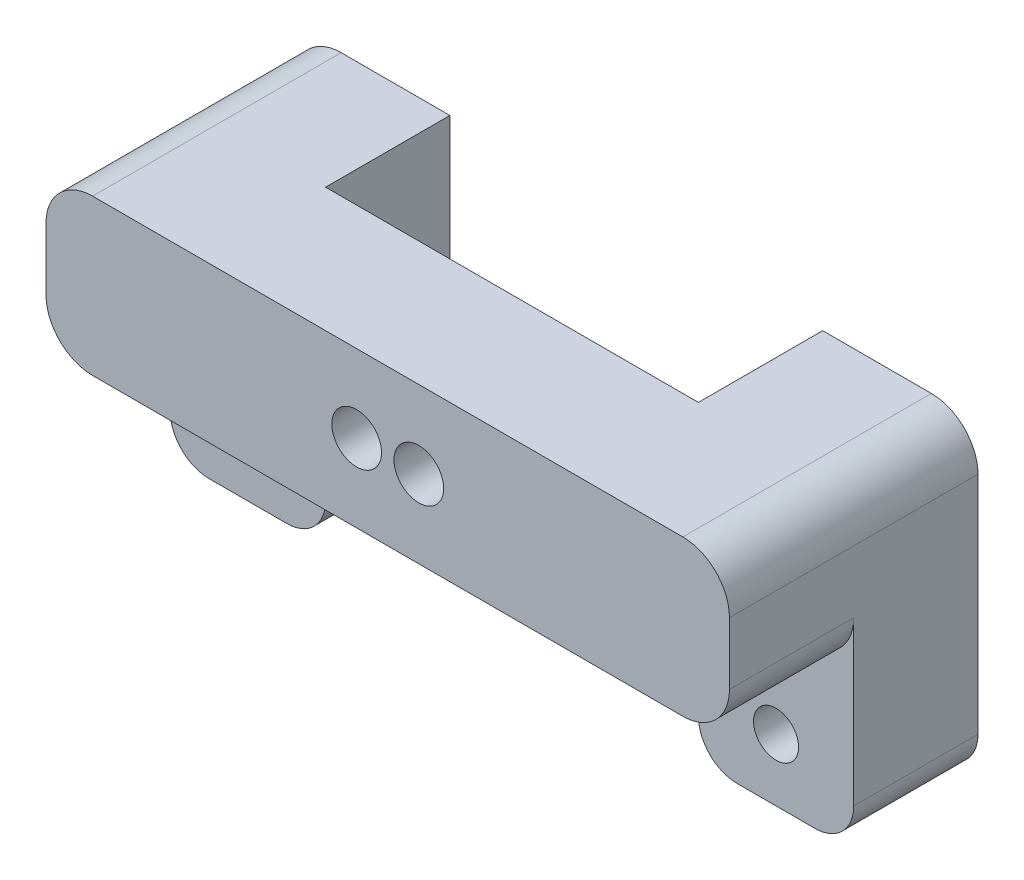
ISO-10303-21;
HEADER;
FILE_DESCRIPTION(('STEP AP214'),'2;1');
FILE_NAME('part.step','',(''),(''),'','','');
FILE_SCHEMA(('AUTOMOTIVE_DESIGN { 1 0 10303 214 1 1 1 1 }'));
ENDSEC;
DATA;
#1=APPLICATION_CONTEXT('core data for automotive mechanical design processes');
#2=APPLICATION_PROTOCOL_DEFINITION('international standard','automotive_design',2000,#1);
#3=PRODUCT_CONTEXT('',#1,'mechanical');
#4=PRODUCT('Part','Part','',(#3));
#5=PRODUCT_RELATED_PRODUCT_CATEGORY('part','',(#4));
#6=PRODUCT_DEFINITION_FORMATION('','',#4);
#7=PRODUCT_DEFINITION_CONTEXT('part definition',#1,'design');
#8=PRODUCT_DEFINITION('design','',#6,#7);
#9=PRODUCT_DEFINITION_SHAPE('','',#8);
#10=(LENGTH_UNIT() NAMED_UNIT(*) SI_UNIT(.MILLI.,.METRE.));
#11=(NAMED_UNIT(*) PLANE_ANGLE_UNIT() SI_UNIT($,.RADIAN.));
#12=(NAMED_UNIT(*) SI_UNIT($,.STERADIAN.) SOLID_ANGLE_UNIT());
#13=UNCERTAINTY_MEASURE_WITH_UNIT(LENGTH_MEASURE(1.E-05),#10,'distance_accuracy_value','');
#14=(GEOMETRIC_REPRESENTATION_CONTEXT(3) GLOBAL_UNCERTAINTY_ASSIGNED_CONTEXT((#13)) GLOBAL_UNIT_ASSIGNED_CONTEXT((#10,
#11,#12)) REPRESENTATION_CONTEXT('',''));
#15=CARTESIAN_POINT('',(0.,0.,0.));
#16=DIRECTION('',(0.,0.,1.));
#17=DIRECTION('',(1.,0.,0.));
#18=AXIS2_PLACEMENT_3D('',#15,#16,#17);
#19=CARTESIAN_POINT('',(0.,-10.,8.));
#20=DIRECTION('',(0.,1.,0.));
#21=DIRECTION('',(0.,0.,1.));
#22=AXIS2_PLACEMENT_3D('',#19,#20,#21);
#23=PLANE('',#22);
#24=DIRECTION('',(1.,0.,0.));
#25=VECTOR('',#24,1.);
#26=CARTESIAN_POINT('',(0.,-10.,8.));
#27=LINE('',#26,#25);
#28=CARTESIAN_POINT('',(3.,-10.,8.));
#29=VERTEX_POINT('',#28);
#30=CARTESIAN_POINT('',(41.,-10.,8.));
#31=VERTEX_POINT('',#30);
#32=EDGE_CURVE('E301',#29,#31,#27,.T.);
#33=ORIENTED_EDGE('',*,*,#32,.F.);
#34=DIRECTION('',(0.,0.,-1.));
#35=VECTOR('',#34,1.);
#36=CARTESIAN_POINT('',(3.,-10.,8.));
#37=LINE('',#36,#35);
#38=CARTESIAN_POINT('',(3.,-10.,0.));
#39=VERTEX_POINT('',#38);
#40=EDGE_CURVE('E254',#29,#39,#37,.T.);
#41=ORIENTED_EDGE('',*,*,#40,.T.);
#42=DIRECTION('',(-1.,0.,0.));
#43=VECTOR('',#42,1.);
#44=CARTESIAN_POINT('',(10.,-10.,0.));
#45=LINE('',#44,#43);
#46=CARTESIAN_POINT('',(10.,-10.,0.));
#47=VERTEX_POINT('',#46);
#48=EDGE_CURVE('E204',#47,#39,#45,.T.);
#49=ORIENTED_EDGE('',*,*,#48,.F.);
#50=DIRECTION('',(1.,0.,0.));
#51=VECTOR('',#50,1.);
#52=CARTESIAN_POINT('',(0.,-10.,0.));
#53=LINE('',#52,#51);
#54=CARTESIAN_POINT('',(34.,-10.,0.));
#55=VERTEX_POINT('',#54);
#56=EDGE_CURVE('E194',#47,#55,#53,.T.);
#57=ORIENTED_EDGE('',*,*,#56,.T.);
#58=DIRECTION('',(-1.,0.,0.));
#59=VECTOR('',#58,1.);
#60=CARTESIAN_POINT('',(34.,-10.,0.));
#61=LINE('',#60,#59);
#62=CARTESIAN_POINT('',(41.,-10.,0.));
#63=VERTEX_POINT('',#62);
#64=EDGE_CURVE('E164',#63,#55,#61,.T.);
#65=ORIENTED_EDGE('',*,*,#64,.F.);
#66=DIRECTION('',(0.,0.,-1.));
#67=VECTOR('',#66,1.);
#68=CARTESIAN_POINT('',(41.,-10.,8.));
#69=LINE('',#68,#67);
#70=EDGE_CURVE('E252',#63,#31,#69,.F.);
#71=ORIENTED_EDGE('',*,*,#70,.T.);
#72=EDGE_LOOP('',(#33,#41,#49,#57,#65,#71));
#73=FACE_BOUND('',#72,.T.);
#74=ADVANCED_FACE('F33',(#73),#23,.F.);
#75=CARTESIAN_POINT('',(0.,0.,0.));
#76=DIRECTION('',(0.,0.,1.));
#77=DIRECTION('',(1.,0.,0.));
#78=AXIS2_PLACEMENT_3D('',#75,#76,#77);
#79=PLANE('',#78);
#80=CARTESIAN_POINT('',(24.,-5.,0.));
#81=DIRECTION('',(0.,0.,1.));
#82=DIRECTION('',(1.,0.,0.));
#83=AXIS2_PLACEMENT_3D('',#80,#81,#82);
#84=CIRCLE('',#83,1.6);
#85=CARTESIAN_POINT('',(25.6,-5.,0.));
#86=VERTEX_POINT('',#85);
#87=EDGE_CURVE('E353',#86,#86,#84,.T.);
#88=ORIENTED_EDGE('',*,*,#87,.T.);
#89=EDGE_LOOP('',(#88));
#90=FACE_BOUND('',#89,.T.);
#91=CARTESIAN_POINT('',(20.,-5.,0.));
#92=DIRECTION('',(0.,0.,1.));
#93=DIRECTION('',(1.,0.,0.));
#94=AXIS2_PLACEMENT_3D('',#91,#92,#93);
#95=CIRCLE('',#94,1.6);
#96=CARTESIAN_POINT('',(21.6,-5.,0.));
#97=VERTEX_POINT('',#96);
#98=EDGE_CURVE('E198',#97,#97,#95,.T.);
#99=ORIENTED_EDGE('',*,*,#98,.T.);
#100=EDGE_LOOP('',(#99));
#101=FACE_BOUND('',#100,.T.);
#102=DIRECTION('',(0.,1.,0.));
#103=VECTOR('',#102,1.);
#104=CARTESIAN_POINT('',(34.,-10.,0.));
#105=LINE('',#104,#103);
#106=CARTESIAN_POINT('',(34.,0.,0.));
#107=VERTEX_POINT('',#106);
#108=EDGE_CURVE('E183',#55,#107,#105,.T.);
#109=ORIENTED_EDGE('',*,*,#108,.F.);
#110=ORIENTED_EDGE('',*,*,#56,.F.);
#111=DIRECTION('',(0.,-1.,0.));
#112=VECTOR('',#111,1.);
#113=CARTESIAN_POINT('',(10.,-10.,0.));
#114=LINE('',#113,#112);
#115=CARTESIAN_POINT('',(10.,0.,0.));
#116=VERTEX_POINT('',#115);
#117=EDGE_CURVE('E319',#116,#47,#114,.T.);
#118=ORIENTED_EDGE('',*,*,#117,.F.);
#119=DIRECTION('',(-1.,0.,0.));
#120=VECTOR('',#119,1.);
#121=CARTESIAN_POINT('',(0.,0.,0.));
#122=LINE('',#121,#120);
#123=EDGE_CURVE('E196',#107,#116,#122,.T.);
#124=ORIENTED_EDGE('',*,*,#123,.F.);
#125=EDGE_LOOP('',(#109,#110,#118,#124));
#126=FACE_BOUND('',#125,.T.);
#127=ADVANCED_FACE('F192',(#90,#101,#126),#79,.F.);
#128=CARTESIAN_POINT('',(0.,0.,8.));
#129=DIRECTION('',(1.,0.,0.));
#130=DIRECTION('',(0.,0.,-1.));
#131=AXIS2_PLACEMENT_3D('',#128,#129,#130);
#132=PLANE('',#131);
#133=DIRECTION('',(0.,1.,0.));
#134=VECTOR('',#133,1.);
#135=CARTESIAN_POINT('',(0.,-20.,0.));
#136=LINE('',#135,#134);
#137=CARTESIAN_POINT('',(0.,-17.5,0.));
#138=VERTEX_POINT('',#137);
#139=CARTESIAN_POINT('',(0.,-7.,0.));
#140=VERTEX_POINT('',#139);
#141=EDGE_CURVE('E285',#138,#140,#136,.T.);
#142=ORIENTED_EDGE('',*,*,#141,.T.);
#143=DIRECTION('',(0.,0.,-1.));
#144=VECTOR('',#143,1.);
#145=CARTESIAN_POINT('',(0.,-7.,8.));
#146=LINE('',#145,#144);
#147=CARTESIAN_POINT('',(0.,-7.,8.));
#148=VERTEX_POINT('',#147);
#149=EDGE_CURVE('E259',#140,#148,#146,.F.);
#150=ORIENTED_EDGE('',*,*,#149,.T.);
#151=DIRECTION('',(0.,-1.,0.));
#152=VECTOR('',#151,1.);
#153=CARTESIAN_POINT('',(0.,0.,8.));
#154=LINE('',#153,#152);
#155=CARTESIAN_POINT('',(0.,-3.,8.));
#156=VERTEX_POINT('',#155);
#157=EDGE_CURVE('E207',#156,#148,#154,.T.);
#158=ORIENTED_EDGE('',*,*,#157,.F.);
#159=DIRECTION('',(0.,0.,-1.));
#160=VECTOR('',#159,1.);
#161=CARTESIAN_POINT('',(0.,-3.,8.));
#162=LINE('',#161,#160);
#163=CARTESIAN_POINT('',(0.,-3.,-8.));
#164=VERTEX_POINT('',#163);
#165=EDGE_CURVE('E256',#156,#164,#162,.T.);
#166=ORIENTED_EDGE('',*,*,#165,.T.);
#167=DIRECTION('',(0.,1.,0.));
#168=VECTOR('',#167,1.);
#169=CARTESIAN_POINT('',(0.,-10.,-8.));
#170=LINE('',#169,#168);
#171=CARTESIAN_POINT('',(0.,-17.5,-8.));
#172=VERTEX_POINT('',#171);
#173=EDGE_CURVE('E314',#172,#164,#170,.T.);
#174=ORIENTED_EDGE('',*,*,#173,.F.);
#175=DIRECTION('',(0.,0.,-1.));
#176=VECTOR('',#175,1.);
#177=CARTESIAN_POINT('',(0.,-17.5,8.));
#178=LINE('',#177,#176);
#179=EDGE_CURVE('E250',#172,#138,#178,.F.);
#180=ORIENTED_EDGE('',*,*,#179,.T.);
#181=EDGE_LOOP('',(#142,#150,#158,#166,#174,#180));
#182=FACE_BOUND('',#181,.T.);
#183=ADVANCED_FACE('F294',(#182),#132,.F.);
#184=CARTESIAN_POINT('',(44.,0.,8.));
#185=DIRECTION('',(-1.,0.,0.));
#186=DIRECTION('',(0.,0.,1.));
#187=AXIS2_PLACEMENT_3D('',#184,#185,#186);
#188=PLANE('',#187);
#189=DIRECTION('',(0.,1.,0.));
#190=VECTOR('',#189,1.);
#191=CARTESIAN_POINT('',(44.,0.,8.));
#192=LINE('',#191,#190);
#193=CARTESIAN_POINT('',(44.,-7.,8.));
#194=VERTEX_POINT('',#193);
#195=CARTESIAN_POINT('',(44.,-3.,8.));
#196=VERTEX_POINT('',#195);
#197=EDGE_CURVE('E303',#194,#196,#192,.T.);
#198=ORIENTED_EDGE('',*,*,#197,.F.);
#199=DIRECTION('',(0.,0.,-1.));
#200=VECTOR('',#199,1.);
#201=CARTESIAN_POINT('',(44.,-7.,8.));
#202=LINE('',#201,#200);
#203=CARTESIAN_POINT('',(44.,-7.,0.));
#204=VERTEX_POINT('',#203);
#205=EDGE_CURVE('E271',#194,#204,#202,.T.);
#206=ORIENTED_EDGE('',*,*,#205,.T.);
#207=DIRECTION('',(0.,1.,0.));
#208=VECTOR('',#207,1.);
#209=CARTESIAN_POINT('',(44.,-20.,0.));
#210=LINE('',#209,#208);
#211=CARTESIAN_POINT('',(44.,-17.5,0.));
#212=VERTEX_POINT('',#211);
#213=EDGE_CURVE('E187',#212,#204,#210,.T.);
#214=ORIENTED_EDGE('',*,*,#213,.F.);
#215=DIRECTION('',(0.,0.,1.));
#216=VECTOR('',#215,1.);
#217=CARTESIAN_POINT('',(44.,-17.5,-8.));
#218=LINE('',#217,#216);
#219=CARTESIAN_POINT('',(44.,-17.5,-8.));
#220=VERTEX_POINT('',#219);
#221=EDGE_CURVE('E226',#212,#220,#218,.F.);
#222=ORIENTED_EDGE('',*,*,#221,.T.);
#223=DIRECTION('',(0.,-1.,0.));
#224=VECTOR('',#223,1.);
#225=CARTESIAN_POINT('',(44.,-10.,-8.));
#226=LINE('',#225,#224);
#227=CARTESIAN_POINT('',(44.,-3.,-8.));
#228=VERTEX_POINT('',#227);
#229=EDGE_CURVE('E197',#228,#220,#226,.T.);
#230=ORIENTED_EDGE('',*,*,#229,.F.);
#231=DIRECTION('',(0.,0.,-1.));
#232=VECTOR('',#231,1.);
#233=CARTESIAN_POINT('',(44.,-3.,8.));
#234=LINE('',#233,#232);
#235=EDGE_CURVE('E269',#228,#196,#234,.F.);
#236=ORIENTED_EDGE('',*,*,#235,.T.);
#237=EDGE_LOOP('',(#198,#206,#214,#222,#230,#236));
#238=FACE_BOUND('',#237,.T.);
#239=ADVANCED_FACE('F420',(#238),#188,.F.);
#240=CARTESIAN_POINT('',(0.,0.,8.));
#241=DIRECTION('',(0.,-1.,0.));
#242=DIRECTION('',(0.,0.,-1.));
#243=AXIS2_PLACEMENT_3D('',#240,#241,#242);
#244=PLANE('',#243);
#245=DIRECTION('',(-1.,0.,0.));
#246=VECTOR('',#245,1.);
#247=CARTESIAN_POINT('',(0.,0.,8.));
#248=LINE('',#247,#246);
#249=CARTESIAN_POINT('',(41.,0.,8.));
#250=VERTEX_POINT('',#249);
#251=CARTESIAN_POINT('',(3.,0.,8.));
#252=VERTEX_POINT('',#251);
#253=EDGE_CURVE('E213',#250,#252,#248,.T.);
#254=ORIENTED_EDGE('',*,*,#253,.F.);
#255=DIRECTION('',(0.,0.,-1.));
#256=VECTOR('',#255,1.);
#257=CARTESIAN_POINT('',(41.,0.,8.));
#258=LINE('',#257,#256);
#259=CARTESIAN_POINT('',(41.,0.,-8.));
#260=VERTEX_POINT('',#259);
#261=EDGE_CURVE('E276',#250,#260,#258,.T.);
#262=ORIENTED_EDGE('',*,*,#261,.T.);
#263=DIRECTION('',(1.,0.,0.));
#264=VECTOR('',#263,1.);
#265=CARTESIAN_POINT('',(44.,0.,-8.));
#266=LINE('',#265,#264);
#267=CARTESIAN_POINT('',(34.,0.,-8.));
#268=VERTEX_POINT('',#267);
#269=EDGE_CURVE('E364',#268,#260,#266,.T.);
#270=ORIENTED_EDGE('',*,*,#269,.F.);
#271=DIRECTION('',(0.,0.,1.));
#272=VECTOR('',#271,1.);
#273=CARTESIAN_POINT('',(34.,0.,-8.));
#274=LINE('',#273,#272);
#275=EDGE_CURVE('E322',#268,#107,#274,.T.);
#276=ORIENTED_EDGE('',*,*,#275,.T.);
#277=ORIENTED_EDGE('',*,*,#123,.T.);
#278=DIRECTION('',(0.,0.,1.));
#279=VECTOR('',#278,1.);
#280=CARTESIAN_POINT('',(10.,0.,-8.));
#281=LINE('',#280,#279);
#282=CARTESIAN_POINT('',(10.,0.,-8.));
#283=VERTEX_POINT('',#282);
#284=EDGE_CURVE('E205',#283,#116,#281,.T.);
#285=ORIENTED_EDGE('',*,*,#284,.F.);
#286=DIRECTION('',(1.,0.,0.));
#287=VECTOR('',#286,1.);
#288=CARTESIAN_POINT('',(0.,0.,-8.));
#289=LINE('',#288,#287);
#290=CARTESIAN_POINT('',(3.,0.,-8.));
#291=VERTEX_POINT('',#290);
#292=EDGE_CURVE('E318',#291,#283,#289,.T.);
#293=ORIENTED_EDGE('',*,*,#292,.F.);
#294=DIRECTION('',(0.,0.,-1.));
#295=VECTOR('',#294,1.);
#296=CARTESIAN_POINT('',(3.,0.,8.));
#297=LINE('',#296,#295);
#298=EDGE_CURVE('E274',#291,#252,#297,.F.);
#299=ORIENTED_EDGE('',*,*,#298,.T.);
#300=EDGE_LOOP('',(#254,#262,#270,#276,#277,#285,#293,#299));
#301=FACE_BOUND('',#300,.T.);
#302=ADVANCED_FACE('F368',(#301),#244,.F.);
#303=CARTESIAN_POINT('',(0.,0.,8.));
#304=DIRECTION('',(0.,0.,1.));
#305=DIRECTION('',(1.,0.,0.));
#306=AXIS2_PLACEMENT_3D('',#303,#304,#305);
#307=PLANE('',#306);
#308=CARTESIAN_POINT('',(24.,-5.,8.));
#309=DIRECTION('',(0.,0.,1.));
#310=DIRECTION('',(1.,0.,0.));
#311=AXIS2_PLACEMENT_3D('',#308,#309,#310);
#312=CIRCLE('',#311,1.6);
#313=CARTESIAN_POINT('',(25.6,-5.,8.));
#314=VERTEX_POINT('',#313);
#315=EDGE_CURVE('E350',#314,#314,#312,.T.);
#316=ORIENTED_EDGE('',*,*,#315,.F.);
#317=EDGE_LOOP('',(#316));
#318=FACE_BOUND('',#317,.T.);
#319=CARTESIAN_POINT('',(20.,-5.,8.));
#320=DIRECTION('',(0.,0.,1.));
#321=DIRECTION('',(1.,0.,0.));
#322=AXIS2_PLACEMENT_3D('',#319,#320,#321);
#323=CIRCLE('',#322,1.6);
#324=CARTESIAN_POINT('',(21.6,-5.,8.));
#325=VERTEX_POINT('',#324);
#326=EDGE_CURVE('E356',#325,#325,#323,.T.);
#327=ORIENTED_EDGE('',*,*,#326,.F.);
#328=EDGE_LOOP('',(#327));
#329=FACE_BOUND('',#328,.T.);
#330=ORIENTED_EDGE('',*,*,#157,.T.);
#331=CARTESIAN_POINT('',(3.,-7.,8.));
#332=DIRECTION('',(0.,0.,1.));
#333=DIRECTION('',(1.,0.,0.));
#334=AXIS2_PLACEMENT_3D('',#331,#332,#333);
#335=CIRCLE('',#334,3.);
#336=EDGE_CURVE('E267',#148,#29,#335,.T.);
#337=ORIENTED_EDGE('',*,*,#336,.T.);
#338=ORIENTED_EDGE('',*,*,#32,.T.);
#339=CARTESIAN_POINT('',(41.,-7.,8.));
#340=DIRECTION('',(0.,0.,1.));
#341=DIRECTION('',(1.,0.,0.));
#342=AXIS2_PLACEMENT_3D('',#339,#340,#341);
#343=CIRCLE('',#342,3.);
#344=EDGE_CURVE('E265',#31,#194,#343,.T.);
#345=ORIENTED_EDGE('',*,*,#344,.T.);
#346=ORIENTED_EDGE('',*,*,#197,.T.);
#347=CARTESIAN_POINT('',(41.,-3.,8.));
#348=DIRECTION('',(0.,0.,1.));
#349=DIRECTION('',(1.,0.,0.));
#350=AXIS2_PLACEMENT_3D('',#347,#348,#349);
#351=CIRCLE('',#350,3.);
#352=EDGE_CURVE('E263',#196,#250,#351,.T.);
#353=ORIENTED_EDGE('',*,*,#352,.T.);
#354=ORIENTED_EDGE('',*,*,#253,.T.);
#355=CARTESIAN_POINT('',(3.,-3.,8.));
#356=DIRECTION('',(0.,0.,1.));
#357=DIRECTION('',(1.,0.,0.));
#358=AXIS2_PLACEMENT_3D('',#355,#356,#357);
#359=CIRCLE('',#358,3.);
#360=EDGE_CURVE('E261',#252,#156,#359,.T.);
#361=ORIENTED_EDGE('',*,*,#360,.T.);
#362=EDGE_LOOP('',(#330,#337,#338,#345,#346,#353,#354,#361));
#363=FACE_BOUND('',#362,.T.);
#364=ADVANCED_FACE('F297',(#318,#329,#363),#307,.T.);
#365=CARTESIAN_POINT('',(10.,-10.,-8.));
#366=DIRECTION('',(-1.,0.,0.));
#367=DIRECTION('',(0.,-1.,0.));
#368=AXIS2_PLACEMENT_3D('',#365,#366,#367);
#369=PLANE('',#368);
#370=DIRECTION('',(0.,1.,0.));
#371=VECTOR('',#370,1.);
#372=CARTESIAN_POINT('',(10.,-20.,0.));
#373=LINE('',#372,#371);
#374=CARTESIAN_POINT('',(10.,-17.5,0.));
#375=VERTEX_POINT('',#374);
#376=EDGE_CURVE('E348',#375,#47,#373,.T.);
#377=ORIENTED_EDGE('',*,*,#376,.F.);
#378=DIRECTION('',(0.,0.,1.));
#379=VECTOR('',#378,1.);
#380=CARTESIAN_POINT('',(10.,-17.5,-8.));
#381=LINE('',#380,#379);
#382=CARTESIAN_POINT('',(10.,-17.5,-8.));
#383=VERTEX_POINT('',#382);
#384=EDGE_CURVE('E244',#375,#383,#381,.F.);
#385=ORIENTED_EDGE('',*,*,#384,.T.);
#386=DIRECTION('',(0.,-1.,0.));
#387=VECTOR('',#386,1.);
#388=CARTESIAN_POINT('',(10.,-10.,-8.));
#389=LINE('',#388,#387);
#390=EDGE_CURVE('E210',#283,#383,#389,.T.);
#391=ORIENTED_EDGE('',*,*,#390,.F.);
#392=ORIENTED_EDGE('',*,*,#284,.T.);
#393=ORIENTED_EDGE('',*,*,#117,.T.);
#394=EDGE_LOOP('',(#377,#385,#391,#392,#393));
#395=FACE_BOUND('',#394,.T.);
#396=ADVANCED_FACE('F467',(#395),#369,.F.);
#397=CARTESIAN_POINT('',(0.,0.,-8.));
#398=DIRECTION('',(0.,0.,-1.));
#399=DIRECTION('',(-1.,0.,0.));
#400=AXIS2_PLACEMENT_3D('',#397,#398,#399);
#401=PLANE('',#400);
#402=CARTESIAN_POINT('',(5.,-16.,-8.));
#403=DIRECTION('',(0.,0.,1.));
#404=DIRECTION('',(1.,0.,0.));
#405=AXIS2_PLACEMENT_3D('',#402,#403,#404);
#406=CIRCLE('',#405,1.45);
#407=CARTESIAN_POINT('',(6.45,-16.,-8.));
#408=VERTEX_POINT('',#407);
#409=EDGE_CURVE('E175',#408,#408,#406,.T.);
#410=ORIENTED_EDGE('',*,*,#409,.T.);
#411=EDGE_LOOP('',(#410));
#412=FACE_BOUND('',#411,.T.);
#413=ORIENTED_EDGE('',*,*,#173,.T.);
#414=CARTESIAN_POINT('',(3.,-3.,-8.));
#415=DIRECTION('',(0.,0.,-1.));
#416=DIRECTION('',(-1.,0.,0.));
#417=AXIS2_PLACEMENT_3D('',#414,#415,#416);
#418=CIRCLE('',#417,3.);
#419=EDGE_CURVE('E48',#164,#291,#418,.T.);
#420=ORIENTED_EDGE('',*,*,#419,.T.);
#421=ORIENTED_EDGE('',*,*,#292,.T.);
#422=ORIENTED_EDGE('',*,*,#390,.T.);
#423=CARTESIAN_POINT('',(7.5,-17.5,-8.));
#424=DIRECTION('',(0.,0.,-1.));
#425=DIRECTION('',(-1.,0.,0.));
#426=AXIS2_PLACEMENT_3D('',#423,#424,#425);
#427=CIRCLE('',#426,2.5);
#428=CARTESIAN_POINT('',(7.5,-20.,-8.));
#429=VERTEX_POINT('',#428);
#430=EDGE_CURVE('E248',#383,#429,#427,.T.);
#431=ORIENTED_EDGE('',*,*,#430,.T.);
#432=DIRECTION('',(1.,0.,0.));
#433=VECTOR('',#432,1.);
#434=CARTESIAN_POINT('',(10.,-20.,-8.));
#435=LINE('',#434,#433);
#436=CARTESIAN_POINT('',(2.5,-20.,-8.));
#437=VERTEX_POINT('',#436);
#438=EDGE_CURVE('E340',#437,#429,#435,.T.);
#439=ORIENTED_EDGE('',*,*,#438,.F.);
#440=CARTESIAN_POINT('',(2.5,-17.5,-8.));
#441=DIRECTION('',(0.,0.,-1.));
#442=DIRECTION('',(-1.,0.,0.));
#443=AXIS2_PLACEMENT_3D('',#440,#441,#442);
#444=CIRCLE('',#443,2.5);
#445=EDGE_CURVE('E246',#437,#172,#444,.T.);
#446=ORIENTED_EDGE('',*,*,#445,.T.);
#447=EDGE_LOOP('',(#413,#420,#421,#422,#431,#439,#446));
#448=FACE_BOUND('',#447,.T.);
#449=ADVANCED_FACE('F316',(#412,#448),#401,.T.);
#450=CARTESIAN_POINT('',(34.,-10.,-8.));
#451=DIRECTION('',(1.,0.,0.));
#452=DIRECTION('',(0.,0.,-1.));
#453=AXIS2_PLACEMENT_3D('',#450,#451,#452);
#454=PLANE('',#453);
#455=DIRECTION('',(0.,1.,0.));
#456=VECTOR('',#455,1.);
#457=CARTESIAN_POINT('',(34.,-10.,-8.));
#458=LINE('',#457,#456);
#459=CARTESIAN_POINT('',(34.,-17.5,-8.));
#460=VERTEX_POINT('',#459);
#461=EDGE_CURVE('E362',#460,#268,#458,.T.);
#462=ORIENTED_EDGE('',*,*,#461,.F.);
#463=DIRECTION('',(0.,0.,-1.));
#464=VECTOR('',#463,1.);
#465=CARTESIAN_POINT('',(34.,-17.5,0.));
#466=LINE('',#465,#464);
#467=CARTESIAN_POINT('',(34.,-17.5,0.));
#468=VERTEX_POINT('',#467);
#469=EDGE_CURVE('E186',#460,#468,#466,.F.);
#470=ORIENTED_EDGE('',*,*,#469,.T.);
#471=DIRECTION('',(0.,1.,0.));
#472=VECTOR('',#471,1.);
#473=CARTESIAN_POINT('',(34.,-20.,0.));
#474=LINE('',#473,#472);
#475=EDGE_CURVE('E168',#468,#55,#474,.T.);
#476=ORIENTED_EDGE('',*,*,#475,.T.);
#477=ORIENTED_EDGE('',*,*,#108,.T.);
#478=ORIENTED_EDGE('',*,*,#275,.F.);
#479=EDGE_LOOP('',(#462,#470,#476,#477,#478));
#480=FACE_BOUND('',#479,.T.);
#481=ADVANCED_FACE('F181',(#480),#454,.F.);
#482=CARTESIAN_POINT('',(0.,0.,-8.));
#483=DIRECTION('',(0.,0.,1.));
#484=DIRECTION('',(1.,0.,0.));
#485=AXIS2_PLACEMENT_3D('',#482,#483,#484);
#486=PLANE('',#485);
#487=CARTESIAN_POINT('',(39.,-16.,-8.));
#488=DIRECTION('',(0.,0.,1.));
#489=DIRECTION('',(1.,0.,0.));
#490=AXIS2_PLACEMENT_3D('',#487,#488,#489);
#491=CIRCLE('',#490,1.45);
#492=CARTESIAN_POINT('',(40.45,-16.,-8.));
#493=VERTEX_POINT('',#492);
#494=EDGE_CURVE('E384',#493,#493,#491,.T.);
#495=ORIENTED_EDGE('',*,*,#494,.T.);
#496=EDGE_LOOP('',(#495));
#497=FACE_BOUND('',#496,.T.);
#498=ORIENTED_EDGE('',*,*,#269,.T.);
#499=CARTESIAN_POINT('',(41.,-3.,-8.));
#500=DIRECTION('',(0.,0.,1.));
#501=DIRECTION('',(1.,0.,0.));
#502=AXIS2_PLACEMENT_3D('',#499,#500,#501);
#503=CIRCLE('',#502,3.);
#504=EDGE_CURVE('E56',#260,#228,#503,.F.);
#505=ORIENTED_EDGE('',*,*,#504,.T.);
#506=ORIENTED_EDGE('',*,*,#229,.T.);
#507=CARTESIAN_POINT('',(41.5,-17.5,-8.));
#508=DIRECTION('',(0.,0.,1.));
#509=DIRECTION('',(1.,0.,0.));
#510=AXIS2_PLACEMENT_3D('',#507,#508,#509);
#511=CIRCLE('',#510,2.5);
#512=CARTESIAN_POINT('',(41.5,-20.,-8.));
#513=VERTEX_POINT('',#512);
#514=EDGE_CURVE('E231',#220,#513,#511,.F.);
#515=ORIENTED_EDGE('',*,*,#514,.T.);
#516=DIRECTION('',(1.,0.,0.));
#517=VECTOR('',#516,1.);
#518=CARTESIAN_POINT('',(34.,-20.,-8.));
#519=LINE('',#518,#517);
#520=CARTESIAN_POINT('',(36.5,-20.,-8.));
#521=VERTEX_POINT('',#520);
#522=EDGE_CURVE('E174',#521,#513,#519,.T.);
#523=ORIENTED_EDGE('',*,*,#522,.F.);
#524=CARTESIAN_POINT('',(36.5,-17.5,-8.));
#525=DIRECTION('',(0.,0.,1.));
#526=DIRECTION('',(1.,0.,0.));
#527=AXIS2_PLACEMENT_3D('',#524,#525,#526);
#528=CIRCLE('',#527,2.5);
#529=EDGE_CURVE('E229',#521,#460,#528,.F.);
#530=ORIENTED_EDGE('',*,*,#529,.T.);
#531=ORIENTED_EDGE('',*,*,#461,.T.);
#532=EDGE_LOOP('',(#498,#505,#506,#515,#523,#530,#531));
#533=FACE_BOUND('',#532,.T.);
#534=ADVANCED_FACE('F393',(#497,#533),#486,.F.);
#535=CARTESIAN_POINT('',(20.,-5.,-8.));
#536=DIRECTION('',(0.,0.,1.));
#537=DIRECTION('',(1.,0.,0.));
#538=AXIS2_PLACEMENT_3D('',#535,#536,#537);
#539=CYLINDRICAL_SURFACE('',#538,1.6);
#540=ORIENTED_EDGE('',*,*,#326,.T.);
#541=EDGE_LOOP('',(#540));
#542=FACE_BOUND('',#541,.T.);
#543=ORIENTED_EDGE('',*,*,#98,.F.);
#544=EDGE_LOOP('',(#543));
#545=FACE_BOUND('',#544,.T.);
#546=ADVANCED_FACE('F453',(#542,#545),#539,.F.);
#547=CARTESIAN_POINT('',(24.,-5.,-8.));
#548=DIRECTION('',(0.,0.,1.));
#549=DIRECTION('',(1.,0.,0.));
#550=AXIS2_PLACEMENT_3D('',#547,#548,#549);
#551=CYLINDRICAL_SURFACE('',#550,1.6);
#552=ORIENTED_EDGE('',*,*,#315,.T.);
#553=EDGE_LOOP('',(#552));
#554=FACE_BOUND('',#553,.T.);
#555=ORIENTED_EDGE('',*,*,#87,.F.);
#556=EDGE_LOOP('',(#555));
#557=FACE_BOUND('',#556,.T.);
#558=ADVANCED_FACE('F459',(#554,#557),#551,.F.);
#559=CARTESIAN_POINT('',(10.,-20.,0.));
#560=DIRECTION('',(0.,0.,-1.));
#561=DIRECTION('',(-1.,0.,0.));
#562=AXIS2_PLACEMENT_3D('',#559,#560,#561);
#563=PLANE('',#562);
#564=CARTESIAN_POINT('',(5.,-16.,0.));
#565=DIRECTION('',(0.,0.,1.));
#566=DIRECTION('',(1.,0.,0.));
#567=AXIS2_PLACEMENT_3D('',#564,#565,#566);
#568=CIRCLE('',#567,1.45);
#569=CARTESIAN_POINT('',(6.45,-16.,0.));
#570=VERTEX_POINT('',#569);
#571=EDGE_CURVE('E381',#570,#570,#568,.T.);
#572=ORIENTED_EDGE('',*,*,#571,.F.);
#573=EDGE_LOOP('',(#572));
#574=FACE_BOUND('',#573,.T.);
#575=DIRECTION('',(-1.,0.,0.));
#576=VECTOR('',#575,1.);
#577=CARTESIAN_POINT('',(10.,-20.,0.));
#578=LINE('',#577,#576);
#579=CARTESIAN_POINT('',(7.5,-20.,0.));
#580=VERTEX_POINT('',#579);
#581=CARTESIAN_POINT('',(2.5,-20.,0.));
#582=VERTEX_POINT('',#581);
#583=EDGE_CURVE('E338',#580,#582,#578,.T.);
#584=ORIENTED_EDGE('',*,*,#583,.F.);
#585=CARTESIAN_POINT('',(7.5,-17.5,0.));
#586=DIRECTION('',(0.,0.,-1.));
#587=DIRECTION('',(-1.,0.,0.));
#588=AXIS2_PLACEMENT_3D('',#585,#586,#587);
#589=CIRCLE('',#588,2.5);
#590=EDGE_CURVE('E242',#580,#375,#589,.F.);
#591=ORIENTED_EDGE('',*,*,#590,.T.);
#592=ORIENTED_EDGE('',*,*,#376,.T.);
#593=ORIENTED_EDGE('',*,*,#48,.T.);
#594=CARTESIAN_POINT('',(3.,-7.,0.));
#595=DIRECTION('',(0.,0.,-1.));
#596=DIRECTION('',(-1.,0.,0.));
#597=AXIS2_PLACEMENT_3D('',#594,#595,#596);
#598=CIRCLE('',#597,3.);
#599=EDGE_CURVE('E41',#39,#140,#598,.T.);
#600=ORIENTED_EDGE('',*,*,#599,.T.);
#601=ORIENTED_EDGE('',*,*,#141,.F.);
#602=CARTESIAN_POINT('',(2.5,-17.5,0.));
#603=DIRECTION('',(0.,0.,-1.));
#604=DIRECTION('',(-1.,0.,0.));
#605=AXIS2_PLACEMENT_3D('',#602,#603,#604);
#606=CIRCLE('',#605,2.5);
#607=EDGE_CURVE('E240',#138,#582,#606,.F.);
#608=ORIENTED_EDGE('',*,*,#607,.T.);
#609=EDGE_LOOP('',(#584,#591,#592,#593,#600,#601,#608));
#610=FACE_BOUND('',#609,.T.);
#611=ADVANCED_FACE('F284',(#574,#610),#563,.F.);
#612=CARTESIAN_POINT('',(0.,-20.,0.));
#613=DIRECTION('',(0.,1.,0.));
#614=DIRECTION('',(0.,0.,1.));
#615=AXIS2_PLACEMENT_3D('',#612,#613,#614);
#616=PLANE('',#615);
#617=ORIENTED_EDGE('',*,*,#438,.T.);
#618=DIRECTION('',(0.,0.,1.));
#619=VECTOR('',#618,1.);
#620=CARTESIAN_POINT('',(7.5,-20.,0.));
#621=LINE('',#620,#619);
#622=EDGE_CURVE('E237',#429,#580,#621,.T.);
#623=ORIENTED_EDGE('',*,*,#622,.T.);
#624=ORIENTED_EDGE('',*,*,#583,.T.);
#625=DIRECTION('',(0.,0.,-1.));
#626=VECTOR('',#625,1.);
#627=CARTESIAN_POINT('',(2.5,-20.,0.));
#628=LINE('',#627,#626);
#629=EDGE_CURVE('E234',#582,#437,#628,.T.);
#630=ORIENTED_EDGE('',*,*,#629,.T.);
#631=EDGE_LOOP('',(#617,#623,#624,#630));
#632=FACE_BOUND('',#631,.T.);
#633=ADVANCED_FACE('F337',(#632),#616,.F.);
#634=CARTESIAN_POINT('',(34.,-20.,0.));
#635=DIRECTION('',(0.,0.,-1.));
#636=DIRECTION('',(-1.,0.,0.));
#637=AXIS2_PLACEMENT_3D('',#634,#635,#636);
#638=PLANE('',#637);
#639=CARTESIAN_POINT('',(39.,-16.,0.));
#640=DIRECTION('',(0.,0.,1.));
#641=DIRECTION('',(1.,0.,0.));
#642=AXIS2_PLACEMENT_3D('',#639,#640,#641);
#643=CIRCLE('',#642,1.45);
#644=CARTESIAN_POINT('',(40.45,-16.,0.));
#645=VERTEX_POINT('',#644);
#646=EDGE_CURVE('E387',#645,#645,#643,.T.);
#647=ORIENTED_EDGE('',*,*,#646,.F.);
#648=EDGE_LOOP('',(#647));
#649=FACE_BOUND('',#648,.T.);
#650=DIRECTION('',(-1.,0.,0.));
#651=VECTOR('',#650,1.);
#652=CARTESIAN_POINT('',(34.,-20.,0.));
#653=LINE('',#652,#651);
#654=CARTESIAN_POINT('',(41.5,-20.,0.));
#655=VERTEX_POINT('',#654);
#656=CARTESIAN_POINT('',(36.5,-20.,0.));
#657=VERTEX_POINT('',#656);
#658=EDGE_CURVE('E188',#655,#657,#653,.T.);
#659=ORIENTED_EDGE('',*,*,#658,.F.);
#660=CARTESIAN_POINT('',(41.5,-17.5,0.));
#661=DIRECTION('',(0.,0.,-1.));
#662=DIRECTION('',(-1.,0.,0.));
#663=AXIS2_PLACEMENT_3D('',#660,#661,#662);
#664=CIRCLE('',#663,2.5);
#665=EDGE_CURVE('E224',#655,#212,#664,.F.);
#666=ORIENTED_EDGE('',*,*,#665,.T.);
#667=ORIENTED_EDGE('',*,*,#213,.T.);
#668=CARTESIAN_POINT('',(41.,-7.,0.));
#669=DIRECTION('',(0.,0.,-1.));
#670=DIRECTION('',(-1.,0.,0.));
#671=AXIS2_PLACEMENT_3D('',#668,#669,#670);
#672=CIRCLE('',#671,3.);
#673=EDGE_CURVE('E11',#204,#63,#672,.T.);
#674=ORIENTED_EDGE('',*,*,#673,.T.);
#675=ORIENTED_EDGE('',*,*,#64,.T.);
#676=ORIENTED_EDGE('',*,*,#475,.F.);
#677=CARTESIAN_POINT('',(36.5,-17.5,0.));
#678=DIRECTION('',(0.,0.,-1.));
#679=DIRECTION('',(-1.,0.,0.));
#680=AXIS2_PLACEMENT_3D('',#677,#678,#679);
#681=CIRCLE('',#680,2.5);
#682=EDGE_CURVE('E222',#468,#657,#681,.F.);
#683=ORIENTED_EDGE('',*,*,#682,.T.);
#684=EDGE_LOOP('',(#659,#666,#667,#674,#675,#676,#683));
#685=FACE_BOUND('',#684,.T.);
#686=ADVANCED_FACE('F167',(#649,#685),#638,.F.);
#687=CARTESIAN_POINT('',(0.,-20.,0.));
#688=DIRECTION('',(0.,-1.,0.));
#689=DIRECTION('',(0.,0.,-1.));
#690=AXIS2_PLACEMENT_3D('',#687,#688,#689);
#691=PLANE('',#690);
#692=ORIENTED_EDGE('',*,*,#522,.T.);
#693=DIRECTION('',(0.,0.,1.));
#694=VECTOR('',#693,1.);
#695=CARTESIAN_POINT('',(41.5,-20.,0.));
#696=LINE('',#695,#694);
#697=EDGE_CURVE('E219',#513,#655,#696,.T.);
#698=ORIENTED_EDGE('',*,*,#697,.T.);
#699=ORIENTED_EDGE('',*,*,#658,.T.);
#700=DIRECTION('',(0.,0.,-1.));
#701=VECTOR('',#700,1.);
#702=CARTESIAN_POINT('',(36.5,-20.,-8.));
#703=LINE('',#702,#701);
#704=EDGE_CURVE('E216',#657,#521,#703,.T.);
#705=ORIENTED_EDGE('',*,*,#704,.T.);
#706=EDGE_LOOP('',(#692,#698,#699,#705));
#707=FACE_BOUND('',#706,.T.);
#708=ADVANCED_FACE('F375',(#707),#691,.T.);
#709=CARTESIAN_POINT('',(5.,-16.,-8.));
#710=DIRECTION('',(0.,0.,1.));
#711=DIRECTION('',(1.,0.,0.));
#712=AXIS2_PLACEMENT_3D('',#709,#710,#711);
#713=CYLINDRICAL_SURFACE('',#712,1.45);
#714=ORIENTED_EDGE('',*,*,#409,.F.);
#715=EDGE_LOOP('',(#714));
#716=FACE_BOUND('',#715,.T.);
#717=ORIENTED_EDGE('',*,*,#571,.T.);
#718=EDGE_LOOP('',(#717));
#719=FACE_BOUND('',#718,.T.);
#720=ADVANCED_FACE('F399',(#716,#719),#713,.F.);
#721=CARTESIAN_POINT('',(39.,-16.,-8.));
#722=DIRECTION('',(0.,0.,1.));
#723=DIRECTION('',(1.,0.,0.));
#724=AXIS2_PLACEMENT_3D('',#721,#722,#723);
#725=CYLINDRICAL_SURFACE('',#724,1.45);
#726=ORIENTED_EDGE('',*,*,#494,.F.);
#727=EDGE_LOOP('',(#726));
#728=FACE_BOUND('',#727,.T.);
#729=ORIENTED_EDGE('',*,*,#646,.T.);
#730=EDGE_LOOP('',(#729));
#731=FACE_BOUND('',#730,.T.);
#732=ADVANCED_FACE('F395',(#728,#731),#725,.F.);
#733=CARTESIAN_POINT('',(41.5,-17.5,0.));
#734=DIRECTION('',(0.,0.,-1.));
#735=DIRECTION('',(-1.,0.,0.));
#736=AXIS2_PLACEMENT_3D('',#733,#734,#735);
#737=CYLINDRICAL_SURFACE('',#736,2.5);
#738=ORIENTED_EDGE('',*,*,#514,.F.);
#739=ORIENTED_EDGE('',*,*,#221,.F.);
#740=ORIENTED_EDGE('',*,*,#665,.F.);
#741=ORIENTED_EDGE('',*,*,#697,.F.);
#742=EDGE_LOOP('',(#738,#739,#740,#741));
#743=FACE_BOUND('',#742,.T.);
#744=ADVANCED_FACE('F398',(#743),#737,.T.);
#745=CARTESIAN_POINT('',(36.5,-17.5,0.));
#746=DIRECTION('',(0.,0.,1.));
#747=DIRECTION('',(1.,0.,0.));
#748=AXIS2_PLACEMENT_3D('',#745,#746,#747);
#749=CYLINDRICAL_SURFACE('',#748,2.5);
#750=ORIENTED_EDGE('',*,*,#682,.F.);
#751=ORIENTED_EDGE('',*,*,#469,.F.);
#752=ORIENTED_EDGE('',*,*,#529,.F.);
#753=ORIENTED_EDGE('',*,*,#704,.F.);
#754=EDGE_LOOP('',(#750,#751,#752,#753));
#755=FACE_BOUND('',#754,.T.);
#756=ADVANCED_FACE('F370',(#755),#749,.T.);
#757=CARTESIAN_POINT('',(7.5,-17.5,0.));
#758=DIRECTION('',(0.,0.,1.));
#759=DIRECTION('',(1.,0.,0.));
#760=AXIS2_PLACEMENT_3D('',#757,#758,#759);
#761=CYLINDRICAL_SURFACE('',#760,2.5);
#762=ORIENTED_EDGE('',*,*,#430,.F.);
#763=ORIENTED_EDGE('',*,*,#384,.F.);
#764=ORIENTED_EDGE('',*,*,#590,.F.);
#765=ORIENTED_EDGE('',*,*,#622,.F.);
#766=EDGE_LOOP('',(#762,#763,#764,#765));
#767=FACE_BOUND('',#766,.T.);
#768=ADVANCED_FACE('F334',(#767),#761,.T.);
#769=CARTESIAN_POINT('',(2.5,-17.5,0.));
#770=DIRECTION('',(0.,0.,-1.));
#771=DIRECTION('',(-1.,0.,0.));
#772=AXIS2_PLACEMENT_3D('',#769,#770,#771);
#773=CYLINDRICAL_SURFACE('',#772,2.5);
#774=ORIENTED_EDGE('',*,*,#607,.F.);
#775=ORIENTED_EDGE('',*,*,#179,.F.);
#776=ORIENTED_EDGE('',*,*,#445,.F.);
#777=ORIENTED_EDGE('',*,*,#629,.F.);
#778=EDGE_LOOP('',(#774,#775,#776,#777));
#779=FACE_BOUND('',#778,.T.);
#780=ADVANCED_FACE('F431',(#779),#773,.T.);
#781=CARTESIAN_POINT('',(3.,-7.,8.));
#782=DIRECTION('',(0.,0.,-1.));
#783=DIRECTION('',(-1.,0.,0.));
#784=AXIS2_PLACEMENT_3D('',#781,#782,#783);
#785=CYLINDRICAL_SURFACE('',#784,3.);
#786=ORIENTED_EDGE('',*,*,#336,.F.);
#787=ORIENTED_EDGE('',*,*,#149,.F.);
#788=ORIENTED_EDGE('',*,*,#599,.F.);
#789=ORIENTED_EDGE('',*,*,#40,.F.);
#790=EDGE_LOOP('',(#786,#787,#788,#789));
#791=FACE_BOUND('',#790,.T.);
#792=ADVANCED_FACE('F290',(#791),#785,.T.);
#793=CARTESIAN_POINT('',(41.,-7.,8.));
#794=DIRECTION('',(0.,0.,-1.));
#795=DIRECTION('',(-1.,0.,0.));
#796=AXIS2_PLACEMENT_3D('',#793,#794,#795);
#797=CYLINDRICAL_SURFACE('',#796,3.);
#798=ORIENTED_EDGE('',*,*,#344,.F.);
#799=ORIENTED_EDGE('',*,*,#70,.F.);
#800=ORIENTED_EDGE('',*,*,#673,.F.);
#801=ORIENTED_EDGE('',*,*,#205,.F.);
#802=EDGE_LOOP('',(#798,#799,#800,#801));
#803=FACE_BOUND('',#802,.T.);
#804=ADVANCED_FACE('F437',(#803),#797,.T.);
#805=CARTESIAN_POINT('',(41.,-3.,8.));
#806=DIRECTION('',(0.,0.,-1.));
#807=DIRECTION('',(-1.,0.,0.));
#808=AXIS2_PLACEMENT_3D('',#805,#806,#807);
#809=CYLINDRICAL_SURFACE('',#808,3.);
#810=ORIENTED_EDGE('',*,*,#352,.F.);
#811=ORIENTED_EDGE('',*,*,#235,.F.);
#812=ORIENTED_EDGE('',*,*,#504,.F.);
#813=ORIENTED_EDGE('',*,*,#261,.F.);
#814=EDGE_LOOP('',(#810,#811,#812,#813));
#815=FACE_BOUND('',#814,.T.);
#816=ADVANCED_FACE('F439',(#815),#809,.T.);
#817=CARTESIAN_POINT('',(3.,-3.,8.));
#818=DIRECTION('',(0.,0.,-1.));
#819=DIRECTION('',(-1.,0.,0.));
#820=AXIS2_PLACEMENT_3D('',#817,#818,#819);
#821=CYLINDRICAL_SURFACE('',#820,3.);
#822=ORIENTED_EDGE('',*,*,#360,.F.);
#823=ORIENTED_EDGE('',*,*,#298,.F.);
#824=ORIENTED_EDGE('',*,*,#419,.F.);
#825=ORIENTED_EDGE('',*,*,#165,.F.);
#826=EDGE_LOOP('',(#822,#823,#824,#825));
#827=FACE_BOUND('',#826,.T.);
#828=ADVANCED_FACE('F35',(#827),#821,.T.);
#829=CLOSED_SHELL('',(#74,#127,#183,#239,#302,#364,#396,#449,#481,#534,#546,#558,#611,#633,#686,
#708,#720,#732,#744,#756,#768,#780,#792,#804,#816,#828));
#830=MANIFOLD_SOLID_BREP('B2',#829);
#831=ADVANCED_BREP_SHAPE_REPRESENTATION('',(#18,#830),#14);
#832=SHAPE_DEFINITION_REPRESENTATION(#9,#831);
ENDSEC;
END-ISO-10303-21;
